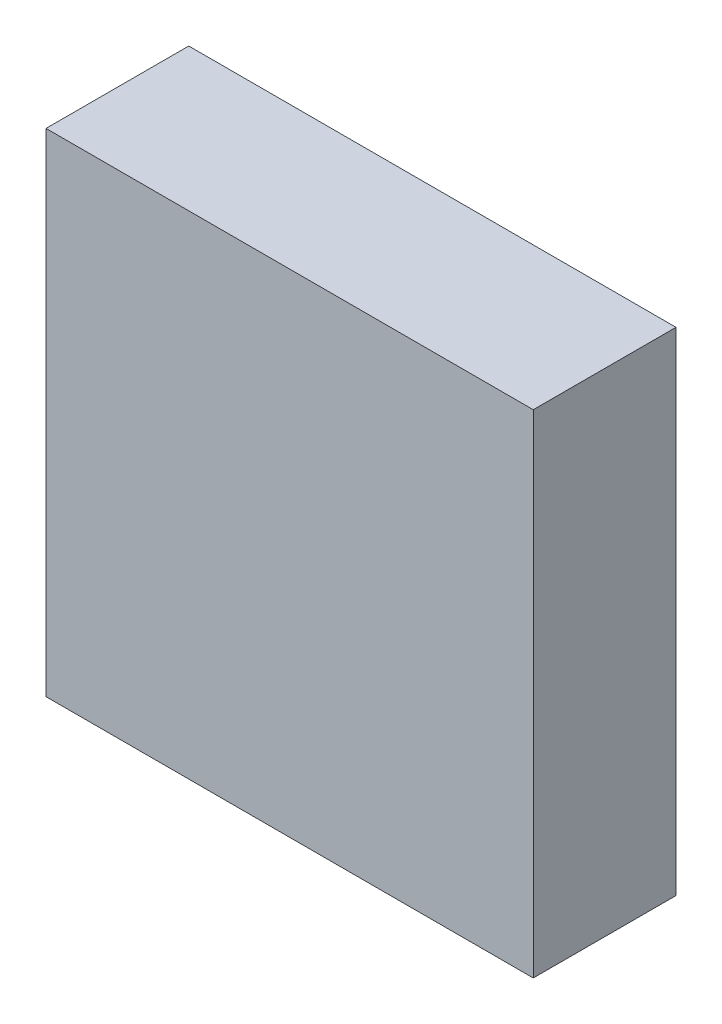
ISO-10303-21;
HEADER;
FILE_DESCRIPTION(('STEP AP214'),'2;1');
FILE_NAME('part.step','',(''),(''),'','','');
FILE_SCHEMA(('AUTOMOTIVE_DESIGN { 1 0 10303 214 1 1 1 1 }'));
ENDSEC;
DATA;
#1=APPLICATION_CONTEXT('core data for automotive mechanical design processes');
#2=APPLICATION_PROTOCOL_DEFINITION('international standard','automotive_design',2000,#1);
#3=PRODUCT_CONTEXT('',#1,'mechanical');
#4=PRODUCT('Part','Part','',(#3));
#5=PRODUCT_RELATED_PRODUCT_CATEGORY('part','',(#4));
#6=PRODUCT_DEFINITION_FORMATION('','',#4);
#7=PRODUCT_DEFINITION_CONTEXT('part definition',#1,'design');
#8=PRODUCT_DEFINITION('design','',#6,#7);
#9=PRODUCT_DEFINITION_SHAPE('','',#8);
#10=(LENGTH_UNIT() NAMED_UNIT(*) SI_UNIT(.MILLI.,.METRE.));
#11=(NAMED_UNIT(*) PLANE_ANGLE_UNIT() SI_UNIT($,.RADIAN.));
#12=(NAMED_UNIT(*) SI_UNIT($,.STERADIAN.) SOLID_ANGLE_UNIT());
#13=UNCERTAINTY_MEASURE_WITH_UNIT(LENGTH_MEASURE(1.E-05),#10,'distance_accuracy_value','');
#14=(GEOMETRIC_REPRESENTATION_CONTEXT(3) GLOBAL_UNCERTAINTY_ASSIGNED_CONTEXT((#13)) GLOBAL_UNIT_ASSIGNED_CONTEXT((#10,
#11,#12)) REPRESENTATION_CONTEXT('',''));
#15=CARTESIAN_POINT('',(0.,0.,0.));
#16=DIRECTION('',(0.,0.,1.));
#17=DIRECTION('',(1.,0.,0.));
#18=AXIS2_PLACEMENT_3D('',#15,#16,#17);
#19=CARTESIAN_POINT('',(0.,1270.,0.));
#20=DIRECTION('',(1.,0.,0.));
#21=DIRECTION('',(0.,0.,-1.));
#22=AXIS2_PLACEMENT_3D('',#19,#20,#21);
#23=PLANE('',#22);
#24=DIRECTION('',(0.,0.,1.));
#25=VECTOR('',#24,1.);
#26=CARTESIAN_POINT('',(0.,0.,0.));
#27=LINE('',#26,#25);
#28=CARTESIAN_POINT('',(0.,0.,-368.3));
#29=VERTEX_POINT('',#28);
#30=CARTESIAN_POINT('',(0.,0.,0.));
#31=VERTEX_POINT('',#30);
#32=EDGE_CURVE('E94',#29,#31,#27,.T.);
#33=ORIENTED_EDGE('',*,*,#32,.T.);
#34=DIRECTION('',(0.,-1.,0.));
#35=VECTOR('',#34,1.);
#36=CARTESIAN_POINT('',(0.,1270.,0.));
#37=LINE('',#36,#35);
#38=CARTESIAN_POINT('',(0.,1270.,0.));
#39=VERTEX_POINT('',#38);
#40=EDGE_CURVE('E11',#39,#31,#37,.T.);
#41=ORIENTED_EDGE('',*,*,#40,.F.);
#42=DIRECTION('',(0.,0.,1.));
#43=VECTOR('',#42,1.);
#44=CARTESIAN_POINT('',(0.,1270.,0.));
#45=LINE('',#44,#43);
#46=CARTESIAN_POINT('',(0.,1270.,-368.3));
#47=VERTEX_POINT('',#46);
#48=EDGE_CURVE('E82',#47,#39,#45,.T.);
#49=ORIENTED_EDGE('',*,*,#48,.F.);
#50=DIRECTION('',(0.,-1.,0.));
#51=VECTOR('',#50,1.);
#52=CARTESIAN_POINT('',(0.,1270.,-368.3));
#53=LINE('',#52,#51);
#54=EDGE_CURVE('E90',#47,#29,#53,.T.);
#55=ORIENTED_EDGE('',*,*,#54,.T.);
#56=EDGE_LOOP('',(#33,#41,#49,#55));
#57=FACE_BOUND('',#56,.T.);
#58=ADVANCED_FACE('F31',(#57),#23,.F.);
#59=CARTESIAN_POINT('',(0.,1270.,0.));
#60=DIRECTION('',(0.,0.,-1.));
#61=DIRECTION('',(-1.,0.,0.));
#62=AXIS2_PLACEMENT_3D('',#59,#60,#61);
#63=PLANE('',#62);
#64=DIRECTION('',(1.,0.,0.));
#65=VECTOR('',#64,1.);
#66=CARTESIAN_POINT('',(0.,0.,0.));
#67=LINE('',#66,#65);
#68=CARTESIAN_POINT('',(1257.3,0.,0.));
#69=VERTEX_POINT('',#68);
#70=EDGE_CURVE('E86',#31,#69,#67,.T.);
#71=ORIENTED_EDGE('',*,*,#70,.T.);
#72=DIRECTION('',(0.,-1.,0.));
#73=VECTOR('',#72,1.);
#74=CARTESIAN_POINT('',(1257.3,1270.,0.));
#75=LINE('',#74,#73);
#76=CARTESIAN_POINT('',(1257.3,1270.,0.));
#77=VERTEX_POINT('',#76);
#78=EDGE_CURVE('E39',#77,#69,#75,.T.);
#79=ORIENTED_EDGE('',*,*,#78,.F.);
#80=DIRECTION('',(1.,0.,0.));
#81=VECTOR('',#80,1.);
#82=CARTESIAN_POINT('',(0.,1270.,0.));
#83=LINE('',#82,#81);
#84=EDGE_CURVE('E77',#39,#77,#83,.T.);
#85=ORIENTED_EDGE('',*,*,#84,.F.);
#86=ORIENTED_EDGE('',*,*,#40,.T.);
#87=EDGE_LOOP('',(#71,#79,#85,#86));
#88=FACE_BOUND('',#87,.T.);
#89=ADVANCED_FACE('F85',(#88),#63,.F.);
#90=CARTESIAN_POINT('',(1257.3,1270.,0.));
#91=DIRECTION('',(-1.,0.,0.));
#92=DIRECTION('',(0.,0.,1.));
#93=AXIS2_PLACEMENT_3D('',#90,#91,#92);
#94=PLANE('',#93);
#95=DIRECTION('',(0.,0.,-1.));
#96=VECTOR('',#95,1.);
#97=CARTESIAN_POINT('',(1257.3,0.,0.));
#98=LINE('',#97,#96);
#99=CARTESIAN_POINT('',(1257.3,0.,-368.3));
#100=VERTEX_POINT('',#99);
#101=EDGE_CURVE('E64',#69,#100,#98,.T.);
#102=ORIENTED_EDGE('',*,*,#101,.T.);
#103=DIRECTION('',(0.,-1.,0.));
#104=VECTOR('',#103,1.);
#105=CARTESIAN_POINT('',(1257.3,1270.,-368.3));
#106=LINE('',#105,#104);
#107=CARTESIAN_POINT('',(1257.3,1270.,-368.3));
#108=VERTEX_POINT('',#107);
#109=EDGE_CURVE('E87',#108,#100,#106,.T.);
#110=ORIENTED_EDGE('',*,*,#109,.F.);
#111=DIRECTION('',(0.,0.,-1.));
#112=VECTOR('',#111,1.);
#113=CARTESIAN_POINT('',(1257.3,1270.,0.));
#114=LINE('',#113,#112);
#115=EDGE_CURVE('E80',#77,#108,#114,.T.);
#116=ORIENTED_EDGE('',*,*,#115,.F.);
#117=ORIENTED_EDGE('',*,*,#78,.T.);
#118=EDGE_LOOP('',(#102,#110,#116,#117));
#119=FACE_BOUND('',#118,.T.);
#120=ADVANCED_FACE('F88',(#119),#94,.F.);
#121=CARTESIAN_POINT('',(0.,1270.,-368.3));
#122=DIRECTION('',(0.,0.,1.));
#123=DIRECTION('',(1.,0.,0.));
#124=AXIS2_PLACEMENT_3D('',#121,#122,#123);
#125=PLANE('',#124);
#126=DIRECTION('',(-1.,0.,0.));
#127=VECTOR('',#126,1.);
#128=CARTESIAN_POINT('',(0.,0.,-368.3));
#129=LINE('',#128,#127);
#130=EDGE_CURVE('E70',#100,#29,#129,.T.);
#131=ORIENTED_EDGE('',*,*,#130,.T.);
#132=ORIENTED_EDGE('',*,*,#54,.F.);
#133=DIRECTION('',(-1.,0.,0.));
#134=VECTOR('',#133,1.);
#135=CARTESIAN_POINT('',(0.,1270.,-368.3));
#136=LINE('',#135,#134);
#137=EDGE_CURVE('E47',#108,#47,#136,.T.);
#138=ORIENTED_EDGE('',*,*,#137,.F.);
#139=ORIENTED_EDGE('',*,*,#109,.T.);
#140=EDGE_LOOP('',(#131,#132,#138,#139));
#141=FACE_BOUND('',#140,.T.);
#142=ADVANCED_FACE('F101',(#141),#125,.F.);
#143=CARTESIAN_POINT('',(0.,1270.,-368.3));
#144=DIRECTION('',(0.,-1.,0.));
#145=DIRECTION('',(0.,0.,-1.));
#146=AXIS2_PLACEMENT_3D('',#143,#144,#145);
#147=PLANE('',#146);
#148=ORIENTED_EDGE('',*,*,#48,.T.);
#149=ORIENTED_EDGE('',*,*,#84,.T.);
#150=ORIENTED_EDGE('',*,*,#115,.T.);
#151=ORIENTED_EDGE('',*,*,#137,.T.);
#152=EDGE_LOOP('',(#148,#149,#150,#151));
#153=FACE_BOUND('',#152,.T.);
#154=ADVANCED_FACE('F78',(#153),#147,.F.);
#155=CARTESIAN_POINT('',(0.,0.,-368.3));
#156=DIRECTION('',(0.,-1.,0.));
#157=DIRECTION('',(0.,0.,-1.));
#158=AXIS2_PLACEMENT_3D('',#155,#156,#157);
#159=PLANE('',#158);
#160=ORIENTED_EDGE('',*,*,#32,.F.);
#161=ORIENTED_EDGE('',*,*,#130,.F.);
#162=ORIENTED_EDGE('',*,*,#101,.F.);
#163=ORIENTED_EDGE('',*,*,#70,.F.);
#164=EDGE_LOOP('',(#160,#161,#162,#163));
#165=FACE_BOUND('',#164,.T.);
#166=ADVANCED_FACE('F104',(#165),#159,.T.);
#167=CLOSED_SHELL('',(#58,#89,#120,#142,#154,#166));
#168=MANIFOLD_SOLID_BREP('B2',#167);
#169=ADVANCED_BREP_SHAPE_REPRESENTATION('',(#18,#168),#14);
#170=SHAPE_DEFINITION_REPRESENTATION(#9,#169);
ENDSEC;
END-ISO-10303-21;
